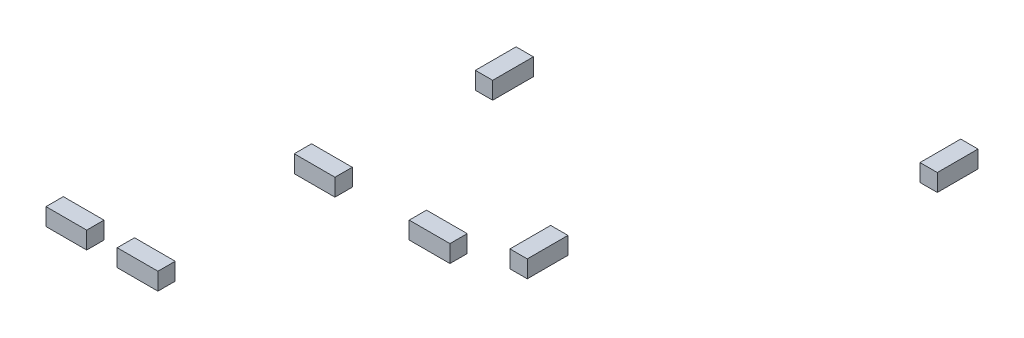
ISO-10303-21;
HEADER;
FILE_DESCRIPTION(('STEP AP214'),'2;1');
FILE_NAME('part.step','',(''),(''),'','','');
FILE_SCHEMA(('AUTOMOTIVE_DESIGN { 1 0 10303 214 1 1 1 1 }'));
ENDSEC;
DATA;
#1=APPLICATION_CONTEXT('core data for automotive mechanical design processes');
#2=APPLICATION_PROTOCOL_DEFINITION('international standard','automotive_design',2000,#1);
#3=PRODUCT_CONTEXT('',#1,'mechanical');
#4=PRODUCT('Part','Part','',(#3));
#5=PRODUCT_RELATED_PRODUCT_CATEGORY('part','',(#4));
#6=PRODUCT_DEFINITION_FORMATION('','',#4);
#7=PRODUCT_DEFINITION_CONTEXT('part definition',#1,'design');
#8=PRODUCT_DEFINITION('design','',#6,#7);
#9=PRODUCT_DEFINITION_SHAPE('','',#8);
#10=(LENGTH_UNIT() NAMED_UNIT(*) SI_UNIT(.MILLI.,.METRE.));
#11=(NAMED_UNIT(*) PLANE_ANGLE_UNIT() SI_UNIT($,.RADIAN.));
#12=(NAMED_UNIT(*) SI_UNIT($,.STERADIAN.) SOLID_ANGLE_UNIT());
#13=UNCERTAINTY_MEASURE_WITH_UNIT(LENGTH_MEASURE(1.E-05),#10,'distance_accuracy_value','');
#14=(GEOMETRIC_REPRESENTATION_CONTEXT(3) GLOBAL_UNCERTAINTY_ASSIGNED_CONTEXT((#13)) GLOBAL_UNIT_ASSIGNED_CONTEXT((#10,
#11,#12)) REPRESENTATION_CONTEXT('',''));
#15=CARTESIAN_POINT('',(0.,0.,0.));
#16=DIRECTION('',(0.,0.,1.));
#17=DIRECTION('',(1.,0.,0.));
#18=AXIS2_PLACEMENT_3D('',#15,#16,#17);
#19=CARTESIAN_POINT('',(3.78459999999999,0.4318,-10.795));
#20=DIRECTION('',(1.,0.,0.));
#21=DIRECTION('',(0.,0.,-1.));
#22=AXIS2_PLACEMENT_3D('',#19,#20,#21);
#23=PLANE('',#22);
#24=DIRECTION('',(0.,0.,1.));
#25=VECTOR('',#24,1.);
#26=CARTESIAN_POINT('',(3.78459999999999,0.,-10.795));
#27=LINE('',#26,#25);
#28=CARTESIAN_POINT('',(3.78459999999999,0.,-11.811));
#29=VERTEX_POINT('',#28);
#30=CARTESIAN_POINT('',(3.78459999999999,0.,-10.795));
#31=VERTEX_POINT('',#30);
#32=EDGE_CURVE('E108',#29,#31,#27,.T.);
#33=ORIENTED_EDGE('',*,*,#32,.T.);
#34=DIRECTION('',(0.,-1.,0.));
#35=VECTOR('',#34,1.);
#36=CARTESIAN_POINT('',(3.78459999999999,0.4318,-10.795));
#37=LINE('',#36,#35);
#38=CARTESIAN_POINT('',(3.78459999999999,0.4318,-10.795));
#39=VERTEX_POINT('',#38);
#40=EDGE_CURVE('E12',#39,#31,#37,.T.);
#41=ORIENTED_EDGE('',*,*,#40,.F.);
#42=DIRECTION('',(0.,0.,1.));
#43=VECTOR('',#42,1.);
#44=CARTESIAN_POINT('',(3.78459999999999,0.4318,-10.795));
#45=LINE('',#44,#43);
#46=CARTESIAN_POINT('',(3.78459999999999,0.4318,-11.811));
#47=VERTEX_POINT('',#46);
#48=EDGE_CURVE('E96',#47,#39,#45,.T.);
#49=ORIENTED_EDGE('',*,*,#48,.F.);
#50=DIRECTION('',(0.,-1.,0.));
#51=VECTOR('',#50,1.);
#52=CARTESIAN_POINT('',(3.78459999999999,0.4318,-11.811));
#53=LINE('',#52,#51);
#54=EDGE_CURVE('E104',#47,#29,#53,.T.);
#55=ORIENTED_EDGE('',*,*,#54,.T.);
#56=EDGE_LOOP('',(#33,#41,#49,#55));
#57=FACE_BOUND('',#56,.T.);
#58=ADVANCED_FACE('F45',(#57),#23,.F.);
#59=CARTESIAN_POINT('',(3.78459999999999,0.4318,-10.795));
#60=DIRECTION('',(0.,0.,-1.));
#61=DIRECTION('',(-1.,0.,0.));
#62=AXIS2_PLACEMENT_3D('',#59,#60,#61);
#63=PLANE('',#62);
#64=DIRECTION('',(1.,0.,0.));
#65=VECTOR('',#64,1.);
#66=CARTESIAN_POINT('',(3.78459999999999,0.,-10.795));
#67=LINE('',#66,#65);
#68=CARTESIAN_POINT('',(4.21639999999999,0.,-10.795));
#69=VERTEX_POINT('',#68);
#70=EDGE_CURVE('E100',#31,#69,#67,.T.);
#71=ORIENTED_EDGE('',*,*,#70,.T.);
#72=DIRECTION('',(0.,-1.,0.));
#73=VECTOR('',#72,1.);
#74=CARTESIAN_POINT('',(4.21639999999999,0.4318,-10.795));
#75=LINE('',#74,#73);
#76=CARTESIAN_POINT('',(4.21639999999999,0.4318,-10.795));
#77=VERTEX_POINT('',#76);
#78=EDGE_CURVE('E53',#77,#69,#75,.T.);
#79=ORIENTED_EDGE('',*,*,#78,.F.);
#80=DIRECTION('',(1.,0.,0.));
#81=VECTOR('',#80,1.);
#82=CARTESIAN_POINT('',(3.78459999999999,0.4318,-10.795));
#83=LINE('',#82,#81);
#84=EDGE_CURVE('E91',#39,#77,#83,.T.);
#85=ORIENTED_EDGE('',*,*,#84,.F.);
#86=ORIENTED_EDGE('',*,*,#40,.T.);
#87=EDGE_LOOP('',(#71,#79,#85,#86));
#88=FACE_BOUND('',#87,.T.);
#89=ADVANCED_FACE('F99',(#88),#63,.F.);
#90=CARTESIAN_POINT('',(4.21639999999999,0.4318,-10.795));
#91=DIRECTION('',(-1.,0.,0.));
#92=DIRECTION('',(0.,0.,1.));
#93=AXIS2_PLACEMENT_3D('',#90,#91,#92);
#94=PLANE('',#93);
#95=DIRECTION('',(0.,0.,-1.));
#96=VECTOR('',#95,1.);
#97=CARTESIAN_POINT('',(4.21639999999999,0.,-10.795));
#98=LINE('',#97,#96);
#99=CARTESIAN_POINT('',(4.21639999999999,0.,-11.811));
#100=VERTEX_POINT('',#99);
#101=EDGE_CURVE('E78',#69,#100,#98,.T.);
#102=ORIENTED_EDGE('',*,*,#101,.T.);
#103=DIRECTION('',(0.,-1.,0.));
#104=VECTOR('',#103,1.);
#105=CARTESIAN_POINT('',(4.21639999999999,0.4318,-11.811));
#106=LINE('',#105,#104);
#107=CARTESIAN_POINT('',(4.21639999999999,0.4318,-11.811));
#108=VERTEX_POINT('',#107);
#109=EDGE_CURVE('E101',#108,#100,#106,.T.);
#110=ORIENTED_EDGE('',*,*,#109,.F.);
#111=DIRECTION('',(0.,0.,-1.));
#112=VECTOR('',#111,1.);
#113=CARTESIAN_POINT('',(4.21639999999999,0.4318,-10.795));
#114=LINE('',#113,#112);
#115=EDGE_CURVE('E94',#77,#108,#114,.T.);
#116=ORIENTED_EDGE('',*,*,#115,.F.);
#117=ORIENTED_EDGE('',*,*,#78,.T.);
#118=EDGE_LOOP('',(#102,#110,#116,#117));
#119=FACE_BOUND('',#118,.T.);
#120=ADVANCED_FACE('F102',(#119),#94,.F.);
#121=CARTESIAN_POINT('',(3.78459999999999,0.4318,-11.811));
#122=DIRECTION('',(0.,0.,1.));
#123=DIRECTION('',(1.,0.,0.));
#124=AXIS2_PLACEMENT_3D('',#121,#122,#123);
#125=PLANE('',#124);
#126=DIRECTION('',(-1.,0.,0.));
#127=VECTOR('',#126,1.);
#128=CARTESIAN_POINT('',(3.78459999999999,0.,-11.811));
#129=LINE('',#128,#127);
#130=EDGE_CURVE('E84',#100,#29,#129,.T.);
#131=ORIENTED_EDGE('',*,*,#130,.T.);
#132=ORIENTED_EDGE('',*,*,#54,.F.);
#133=DIRECTION('',(-1.,0.,0.));
#134=VECTOR('',#133,1.);
#135=CARTESIAN_POINT('',(3.78459999999999,0.4318,-11.811));
#136=LINE('',#135,#134);
#137=EDGE_CURVE('E61',#108,#47,#136,.T.);
#138=ORIENTED_EDGE('',*,*,#137,.F.);
#139=ORIENTED_EDGE('',*,*,#109,.T.);
#140=EDGE_LOOP('',(#131,#132,#138,#139));
#141=FACE_BOUND('',#140,.T.);
#142=ADVANCED_FACE('F115',(#141),#125,.F.);
#143=CARTESIAN_POINT('',(0.,0.4318,0.));
#144=DIRECTION('',(0.,-1.,0.));
#145=DIRECTION('',(0.,0.,-1.));
#146=AXIS2_PLACEMENT_3D('',#143,#144,#145);
#147=PLANE('',#146);
#148=ORIENTED_EDGE('',*,*,#48,.T.);
#149=ORIENTED_EDGE('',*,*,#84,.T.);
#150=ORIENTED_EDGE('',*,*,#115,.T.);
#151=ORIENTED_EDGE('',*,*,#137,.T.);
#152=EDGE_LOOP('',(#148,#149,#150,#151));
#153=FACE_BOUND('',#152,.T.);
#154=ADVANCED_FACE('F92',(#153),#147,.F.);
#155=CARTESIAN_POINT('',(0.,0.,0.));
#156=DIRECTION('',(0.,-1.,0.));
#157=DIRECTION('',(0.,0.,-1.));
#158=AXIS2_PLACEMENT_3D('',#155,#156,#157);
#159=PLANE('',#158);
#160=ORIENTED_EDGE('',*,*,#32,.F.);
#161=ORIENTED_EDGE('',*,*,#130,.F.);
#162=ORIENTED_EDGE('',*,*,#101,.F.);
#163=ORIENTED_EDGE('',*,*,#70,.F.);
#164=EDGE_LOOP('',(#160,#161,#162,#163));
#165=FACE_BOUND('',#164,.T.);
#166=ADVANCED_FACE('F118',(#165),#159,.T.);
#167=CLOSED_SHELL('',(#58,#89,#120,#142,#154,#166));
#168=MANIFOLD_SOLID_BREP('B2',#167);
#169=CARTESIAN_POINT('',(1.905,0.4318,-10.5918));
#170=DIRECTION('',(1.,0.,0.));
#171=DIRECTION('',(0.,0.,-1.));
#172=AXIS2_PLACEMENT_3D('',#169,#170,#171);
#173=PLANE('',#172);
#174=DIRECTION('',(0.,0.,1.));
#175=VECTOR('',#174,1.);
#176=CARTESIAN_POINT('',(1.905,0.,-10.5918));
#177=LINE('',#176,#175);
#178=CARTESIAN_POINT('',(1.905,0.,-10.5918));
#179=VERTEX_POINT('',#178);
#180=CARTESIAN_POINT('',(1.905,0.,-10.16));
#181=VERTEX_POINT('',#180);
#182=EDGE_CURVE('E241',#179,#181,#177,.T.);
#183=ORIENTED_EDGE('',*,*,#182,.T.);
#184=DIRECTION('',(0.,-1.,0.));
#185=VECTOR('',#184,1.);
#186=CARTESIAN_POINT('',(1.905,0.4318,-10.16));
#187=LINE('',#186,#185);
#188=CARTESIAN_POINT('',(1.905,0.4318,-10.16));
#189=VERTEX_POINT('',#188);
#190=EDGE_CURVE('E43',#189,#181,#187,.T.);
#191=ORIENTED_EDGE('',*,*,#190,.F.);
#192=DIRECTION('',(0.,0.,1.));
#193=VECTOR('',#192,1.);
#194=CARTESIAN_POINT('',(1.905,0.4318,-10.5918));
#195=LINE('',#194,#193);
#196=CARTESIAN_POINT('',(1.905,0.4318,-10.5918));
#197=VERTEX_POINT('',#196);
#198=EDGE_CURVE('E229',#197,#189,#195,.T.);
#199=ORIENTED_EDGE('',*,*,#198,.F.);
#200=DIRECTION('',(0.,-1.,0.));
#201=VECTOR('',#200,1.);
#202=CARTESIAN_POINT('',(1.905,0.4318,-10.5918));
#203=LINE('',#202,#201);
#204=EDGE_CURVE('E237',#197,#179,#203,.T.);
#205=ORIENTED_EDGE('',*,*,#204,.T.);
#206=EDGE_LOOP('',(#183,#191,#199,#205));
#207=FACE_BOUND('',#206,.T.);
#208=ADVANCED_FACE('F178',(#207),#173,.F.);
#209=CARTESIAN_POINT('',(1.905,0.4318,-10.16));
#210=DIRECTION('',(0.,0.,-1.));
#211=DIRECTION('',(-1.,0.,0.));
#212=AXIS2_PLACEMENT_3D('',#209,#210,#211);
#213=PLANE('',#212);
#214=DIRECTION('',(1.,0.,0.));
#215=VECTOR('',#214,1.);
#216=CARTESIAN_POINT('',(1.905,0.,-10.16));
#217=LINE('',#216,#215);
#218=CARTESIAN_POINT('',(2.921,0.,-10.16));
#219=VERTEX_POINT('',#218);
#220=EDGE_CURVE('E233',#181,#219,#217,.T.);
#221=ORIENTED_EDGE('',*,*,#220,.T.);
#222=DIRECTION('',(0.,-1.,0.));
#223=VECTOR('',#222,1.);
#224=CARTESIAN_POINT('',(2.921,0.4318,-10.16));
#225=LINE('',#224,#223);
#226=CARTESIAN_POINT('',(2.921,0.4318,-10.16));
#227=VERTEX_POINT('',#226);
#228=EDGE_CURVE('E186',#227,#219,#225,.T.);
#229=ORIENTED_EDGE('',*,*,#228,.F.);
#230=DIRECTION('',(1.,0.,0.));
#231=VECTOR('',#230,1.);
#232=CARTESIAN_POINT('',(1.905,0.4318,-10.16));
#233=LINE('',#232,#231);
#234=EDGE_CURVE('E224',#189,#227,#233,.T.);
#235=ORIENTED_EDGE('',*,*,#234,.F.);
#236=ORIENTED_EDGE('',*,*,#190,.T.);
#237=EDGE_LOOP('',(#221,#229,#235,#236));
#238=FACE_BOUND('',#237,.T.);
#239=ADVANCED_FACE('F232',(#238),#213,.F.);
#240=CARTESIAN_POINT('',(2.921,0.4318,-10.5918));
#241=DIRECTION('',(-1.,0.,0.));
#242=DIRECTION('',(0.,0.,1.));
#243=AXIS2_PLACEMENT_3D('',#240,#241,#242);
#244=PLANE('',#243);
#245=DIRECTION('',(0.,0.,-1.));
#246=VECTOR('',#245,1.);
#247=CARTESIAN_POINT('',(2.921,0.,-10.5918));
#248=LINE('',#247,#246);
#249=CARTESIAN_POINT('',(2.921,0.,-10.5918));
#250=VERTEX_POINT('',#249);
#251=EDGE_CURVE('E211',#219,#250,#248,.T.);
#252=ORIENTED_EDGE('',*,*,#251,.T.);
#253=DIRECTION('',(0.,-1.,0.));
#254=VECTOR('',#253,1.);
#255=CARTESIAN_POINT('',(2.921,0.4318,-10.5918));
#256=LINE('',#255,#254);
#257=CARTESIAN_POINT('',(2.921,0.4318,-10.5918));
#258=VERTEX_POINT('',#257);
#259=EDGE_CURVE('E234',#258,#250,#256,.T.);
#260=ORIENTED_EDGE('',*,*,#259,.F.);
#261=DIRECTION('',(0.,0.,-1.));
#262=VECTOR('',#261,1.);
#263=CARTESIAN_POINT('',(2.921,0.4318,-10.5918));
#264=LINE('',#263,#262);
#265=EDGE_CURVE('E227',#227,#258,#264,.T.);
#266=ORIENTED_EDGE('',*,*,#265,.F.);
#267=ORIENTED_EDGE('',*,*,#228,.T.);
#268=EDGE_LOOP('',(#252,#260,#266,#267));
#269=FACE_BOUND('',#268,.T.);
#270=ADVANCED_FACE('F235',(#269),#244,.F.);
#271=CARTESIAN_POINT('',(1.905,0.4318,-10.5918));
#272=DIRECTION('',(0.,0.,1.));
#273=DIRECTION('',(1.,0.,0.));
#274=AXIS2_PLACEMENT_3D('',#271,#272,#273);
#275=PLANE('',#274);
#276=DIRECTION('',(-1.,0.,0.));
#277=VECTOR('',#276,1.);
#278=CARTESIAN_POINT('',(1.905,0.,-10.5918));
#279=LINE('',#278,#277);
#280=EDGE_CURVE('E217',#250,#179,#279,.T.);
#281=ORIENTED_EDGE('',*,*,#280,.T.);
#282=ORIENTED_EDGE('',*,*,#204,.F.);
#283=DIRECTION('',(-1.,0.,0.));
#284=VECTOR('',#283,1.);
#285=CARTESIAN_POINT('',(1.905,0.4318,-10.5918));
#286=LINE('',#285,#284);
#287=EDGE_CURVE('E194',#258,#197,#286,.T.);
#288=ORIENTED_EDGE('',*,*,#287,.F.);
#289=ORIENTED_EDGE('',*,*,#259,.T.);
#290=EDGE_LOOP('',(#281,#282,#288,#289));
#291=FACE_BOUND('',#290,.T.);
#292=ADVANCED_FACE('F248',(#291),#275,.F.);
#293=CARTESIAN_POINT('',(0.,0.4318,0.));
#294=DIRECTION('',(0.,1.,0.));
#295=DIRECTION('',(0.,0.,1.));
#296=AXIS2_PLACEMENT_3D('',#293,#294,#295);
#297=PLANE('',#296);
#298=ORIENTED_EDGE('',*,*,#198,.T.);
#299=ORIENTED_EDGE('',*,*,#234,.T.);
#300=ORIENTED_EDGE('',*,*,#265,.T.);
#301=ORIENTED_EDGE('',*,*,#287,.T.);
#302=EDGE_LOOP('',(#298,#299,#300,#301));
#303=FACE_BOUND('',#302,.T.);
#304=ADVANCED_FACE('F225',(#303),#297,.T.);
#305=CARTESIAN_POINT('',(0.,0.,0.));
#306=DIRECTION('',(0.,1.,0.));
#307=DIRECTION('',(0.,0.,1.));
#308=AXIS2_PLACEMENT_3D('',#305,#306,#307);
#309=PLANE('',#308);
#310=ORIENTED_EDGE('',*,*,#182,.F.);
#311=ORIENTED_EDGE('',*,*,#280,.F.);
#312=ORIENTED_EDGE('',*,*,#251,.F.);
#313=ORIENTED_EDGE('',*,*,#220,.F.);
#314=EDGE_LOOP('',(#310,#311,#312,#313));
#315=FACE_BOUND('',#314,.T.);
#316=ADVANCED_FACE('F251',(#315),#309,.F.);
#317=CLOSED_SHELL('',(#208,#239,#270,#292,#304,#316));
#318=MANIFOLD_SOLID_BREP('B6',#317);
#319=CARTESIAN_POINT('',(-0.9652,0.4318,-10.5918));
#320=DIRECTION('',(1.,0.,0.));
#321=DIRECTION('',(0.,0.,-1.));
#322=AXIS2_PLACEMENT_3D('',#319,#320,#321);
#323=PLANE('',#322);
#324=DIRECTION('',(0.,0.,1.));
#325=VECTOR('',#324,1.);
#326=CARTESIAN_POINT('',(-0.9652,0.,-10.5918));
#327=LINE('',#326,#325);
#328=CARTESIAN_POINT('',(-0.9652,0.,-10.5918));
#329=VERTEX_POINT('',#328);
#330=CARTESIAN_POINT('',(-0.9652,0.,-10.16));
#331=VERTEX_POINT('',#330);
#332=EDGE_CURVE('E374',#329,#331,#327,.T.);
#333=ORIENTED_EDGE('',*,*,#332,.T.);
#334=DIRECTION('',(0.,-1.,0.));
#335=VECTOR('',#334,1.);
#336=CARTESIAN_POINT('',(-0.9652,0.4318,-10.16));
#337=LINE('',#336,#335);
#338=CARTESIAN_POINT('',(-0.9652,0.4318,-10.16));
#339=VERTEX_POINT('',#338);
#340=EDGE_CURVE('E176',#339,#331,#337,.T.);
#341=ORIENTED_EDGE('',*,*,#340,.F.);
#342=DIRECTION('',(0.,0.,1.));
#343=VECTOR('',#342,1.);
#344=CARTESIAN_POINT('',(-0.9652,0.4318,-10.5918));
#345=LINE('',#344,#343);
#346=CARTESIAN_POINT('',(-0.9652,0.4318,-10.5918));
#347=VERTEX_POINT('',#346);
#348=EDGE_CURVE('E362',#347,#339,#345,.T.);
#349=ORIENTED_EDGE('',*,*,#348,.F.);
#350=DIRECTION('',(0.,-1.,0.));
#351=VECTOR('',#350,1.);
#352=CARTESIAN_POINT('',(-0.9652,0.4318,-10.5918));
#353=LINE('',#352,#351);
#354=EDGE_CURVE('E370',#347,#329,#353,.T.);
#355=ORIENTED_EDGE('',*,*,#354,.T.);
#356=EDGE_LOOP('',(#333,#341,#349,#355));
#357=FACE_BOUND('',#356,.T.);
#358=ADVANCED_FACE('F311',(#357),#323,.F.);
#359=CARTESIAN_POINT('',(-0.9652,0.4318,-10.16));
#360=DIRECTION('',(0.,0.,-1.));
#361=DIRECTION('',(-1.,0.,0.));
#362=AXIS2_PLACEMENT_3D('',#359,#360,#361);
#363=PLANE('',#362);
#364=DIRECTION('',(1.,0.,0.));
#365=VECTOR('',#364,1.);
#366=CARTESIAN_POINT('',(-0.9652,0.,-10.16));
#367=LINE('',#366,#365);
#368=CARTESIAN_POINT('',(0.0508000000000002,0.,-10.16));
#369=VERTEX_POINT('',#368);
#370=EDGE_CURVE('E366',#331,#369,#367,.T.);
#371=ORIENTED_EDGE('',*,*,#370,.T.);
#372=DIRECTION('',(0.,-1.,0.));
#373=VECTOR('',#372,1.);
#374=CARTESIAN_POINT('',(0.0508000000000002,0.4318,-10.16));
#375=LINE('',#374,#373);
#376=CARTESIAN_POINT('',(0.0508000000000002,0.4318,-10.16));
#377=VERTEX_POINT('',#376);
#378=EDGE_CURVE('E319',#377,#369,#375,.T.);
#379=ORIENTED_EDGE('',*,*,#378,.F.);
#380=DIRECTION('',(1.,0.,0.));
#381=VECTOR('',#380,1.);
#382=CARTESIAN_POINT('',(-0.9652,0.4318,-10.16));
#383=LINE('',#382,#381);
#384=EDGE_CURVE('E357',#339,#377,#383,.T.);
#385=ORIENTED_EDGE('',*,*,#384,.F.);
#386=ORIENTED_EDGE('',*,*,#340,.T.);
#387=EDGE_LOOP('',(#371,#379,#385,#386));
#388=FACE_BOUND('',#387,.T.);
#389=ADVANCED_FACE('F365',(#388),#363,.F.);
#390=CARTESIAN_POINT('',(0.0508000000000002,0.4318,-10.5918));
#391=DIRECTION('',(-1.,0.,0.));
#392=DIRECTION('',(0.,0.,1.));
#393=AXIS2_PLACEMENT_3D('',#390,#391,#392);
#394=PLANE('',#393);
#395=DIRECTION('',(0.,0.,-1.));
#396=VECTOR('',#395,1.);
#397=CARTESIAN_POINT('',(0.0508000000000002,0.,-10.5918));
#398=LINE('',#397,#396);
#399=CARTESIAN_POINT('',(0.0508000000000002,0.,-10.5918));
#400=VERTEX_POINT('',#399);
#401=EDGE_CURVE('E344',#369,#400,#398,.T.);
#402=ORIENTED_EDGE('',*,*,#401,.T.);
#403=DIRECTION('',(0.,-1.,0.));
#404=VECTOR('',#403,1.);
#405=CARTESIAN_POINT('',(0.0508000000000002,0.4318,-10.5918));
#406=LINE('',#405,#404);
#407=CARTESIAN_POINT('',(0.0508000000000002,0.4318,-10.5918));
#408=VERTEX_POINT('',#407);
#409=EDGE_CURVE('E367',#408,#400,#406,.T.);
#410=ORIENTED_EDGE('',*,*,#409,.F.);
#411=DIRECTION('',(0.,0.,-1.));
#412=VECTOR('',#411,1.);
#413=CARTESIAN_POINT('',(0.0508000000000002,0.4318,-10.5918));
#414=LINE('',#413,#412);
#415=EDGE_CURVE('E360',#377,#408,#414,.T.);
#416=ORIENTED_EDGE('',*,*,#415,.F.);
#417=ORIENTED_EDGE('',*,*,#378,.T.);
#418=EDGE_LOOP('',(#402,#410,#416,#417));
#419=FACE_BOUND('',#418,.T.);
#420=ADVANCED_FACE('F368',(#419),#394,.F.);
#421=CARTESIAN_POINT('',(-0.9652,0.4318,-10.5918));
#422=DIRECTION('',(0.,0.,1.));
#423=DIRECTION('',(1.,0.,0.));
#424=AXIS2_PLACEMENT_3D('',#421,#422,#423);
#425=PLANE('',#424);
#426=DIRECTION('',(-1.,0.,0.));
#427=VECTOR('',#426,1.);
#428=CARTESIAN_POINT('',(-0.9652,0.,-10.5918));
#429=LINE('',#428,#427);
#430=EDGE_CURVE('E350',#400,#329,#429,.T.);
#431=ORIENTED_EDGE('',*,*,#430,.T.);
#432=ORIENTED_EDGE('',*,*,#354,.F.);
#433=DIRECTION('',(-1.,0.,0.));
#434=VECTOR('',#433,1.);
#435=CARTESIAN_POINT('',(-0.9652,0.4318,-10.5918));
#436=LINE('',#435,#434);
#437=EDGE_CURVE('E327',#408,#347,#436,.T.);
#438=ORIENTED_EDGE('',*,*,#437,.F.);
#439=ORIENTED_EDGE('',*,*,#409,.T.);
#440=EDGE_LOOP('',(#431,#432,#438,#439));
#441=FACE_BOUND('',#440,.T.);
#442=ADVANCED_FACE('F381',(#441),#425,.F.);
#443=CARTESIAN_POINT('',(0.,0.4318,0.));
#444=DIRECTION('',(0.,1.,0.));
#445=DIRECTION('',(0.,0.,1.));
#446=AXIS2_PLACEMENT_3D('',#443,#444,#445);
#447=PLANE('',#446);
#448=ORIENTED_EDGE('',*,*,#348,.T.);
#449=ORIENTED_EDGE('',*,*,#384,.T.);
#450=ORIENTED_EDGE('',*,*,#415,.T.);
#451=ORIENTED_EDGE('',*,*,#437,.T.);
#452=EDGE_LOOP('',(#448,#449,#450,#451));
#453=FACE_BOUND('',#452,.T.);
#454=ADVANCED_FACE('F358',(#453),#447,.T.);
#455=CARTESIAN_POINT('',(0.,0.,0.));
#456=DIRECTION('',(0.,1.,0.));
#457=DIRECTION('',(0.,0.,1.));
#458=AXIS2_PLACEMENT_3D('',#455,#456,#457);
#459=PLANE('',#458);
#460=ORIENTED_EDGE('',*,*,#332,.F.);
#461=ORIENTED_EDGE('',*,*,#430,.F.);
#462=ORIENTED_EDGE('',*,*,#401,.F.);
#463=ORIENTED_EDGE('',*,*,#370,.F.);
#464=EDGE_LOOP('',(#460,#461,#462,#463));
#465=FACE_BOUND('',#464,.T.);
#466=ADVANCED_FACE('F384',(#465),#459,.F.);
#467=CLOSED_SHELL('',(#358,#389,#420,#442,#454,#466));
#468=MANIFOLD_SOLID_BREP('B37',#467);
#469=CARTESIAN_POINT('',(-2.921,0.4318,-6.35));
#470=DIRECTION('',(1.,0.,0.));
#471=DIRECTION('',(0.,0.,-1.));
#472=AXIS2_PLACEMENT_3D('',#469,#470,#471);
#473=PLANE('',#472);
#474=DIRECTION('',(0.,0.,1.));
#475=VECTOR('',#474,1.);
#476=CARTESIAN_POINT('',(-2.921,0.,-6.35));
#477=LINE('',#476,#475);
#478=CARTESIAN_POINT('',(-2.921,0.,-6.35));
#479=VERTEX_POINT('',#478);
#480=CARTESIAN_POINT('',(-2.921,0.,-5.9182));
#481=VERTEX_POINT('',#480);
#482=EDGE_CURVE('E507',#479,#481,#477,.T.);
#483=ORIENTED_EDGE('',*,*,#482,.T.);
#484=DIRECTION('',(0.,-1.,0.));
#485=VECTOR('',#484,1.);
#486=CARTESIAN_POINT('',(-2.921,0.4318,-5.9182));
#487=LINE('',#486,#485);
#488=CARTESIAN_POINT('',(-2.921,0.4318,-5.9182));
#489=VERTEX_POINT('',#488);
#490=EDGE_CURVE('E309',#489,#481,#487,.T.);
#491=ORIENTED_EDGE('',*,*,#490,.F.);
#492=DIRECTION('',(0.,0.,1.));
#493=VECTOR('',#492,1.);
#494=CARTESIAN_POINT('',(-2.921,0.4318,-6.35));
#495=LINE('',#494,#493);
#496=CARTESIAN_POINT('',(-2.921,0.4318,-6.35));
#497=VERTEX_POINT('',#496);
#498=EDGE_CURVE('E495',#497,#489,#495,.T.);
#499=ORIENTED_EDGE('',*,*,#498,.F.);
#500=DIRECTION('',(0.,-1.,0.));
#501=VECTOR('',#500,1.);
#502=CARTESIAN_POINT('',(-2.921,0.4318,-6.35));
#503=LINE('',#502,#501);
#504=EDGE_CURVE('E503',#497,#479,#503,.T.);
#505=ORIENTED_EDGE('',*,*,#504,.T.);
#506=EDGE_LOOP('',(#483,#491,#499,#505));
#507=FACE_BOUND('',#506,.T.);
#508=ADVANCED_FACE('F444',(#507),#473,.F.);
#509=CARTESIAN_POINT('',(-2.921,0.4318,-5.9182));
#510=DIRECTION('',(0.,0.,-1.));
#511=DIRECTION('',(-1.,0.,0.));
#512=AXIS2_PLACEMENT_3D('',#509,#510,#511);
#513=PLANE('',#512);
#514=DIRECTION('',(1.,0.,0.));
#515=VECTOR('',#514,1.);
#516=CARTESIAN_POINT('',(-2.921,0.,-5.9182));
#517=LINE('',#516,#515);
#518=CARTESIAN_POINT('',(-1.905,0.,-5.9182));
#519=VERTEX_POINT('',#518);
#520=EDGE_CURVE('E499',#481,#519,#517,.T.);
#521=ORIENTED_EDGE('',*,*,#520,.T.);
#522=DIRECTION('',(0.,-1.,0.));
#523=VECTOR('',#522,1.);
#524=CARTESIAN_POINT('',(-1.905,0.4318,-5.9182));
#525=LINE('',#524,#523);
#526=CARTESIAN_POINT('',(-1.905,0.4318,-5.9182));
#527=VERTEX_POINT('',#526);
#528=EDGE_CURVE('E452',#527,#519,#525,.T.);
#529=ORIENTED_EDGE('',*,*,#528,.F.);
#530=DIRECTION('',(1.,0.,0.));
#531=VECTOR('',#530,1.);
#532=CARTESIAN_POINT('',(-2.921,0.4318,-5.9182));
#533=LINE('',#532,#531);
#534=EDGE_CURVE('E490',#489,#527,#533,.T.);
#535=ORIENTED_EDGE('',*,*,#534,.F.);
#536=ORIENTED_EDGE('',*,*,#490,.T.);
#537=EDGE_LOOP('',(#521,#529,#535,#536));
#538=FACE_BOUND('',#537,.T.);
#539=ADVANCED_FACE('F498',(#538),#513,.F.);
#540=CARTESIAN_POINT('',(-1.905,0.4318,-6.35));
#541=DIRECTION('',(-1.,0.,0.));
#542=DIRECTION('',(0.,0.,1.));
#543=AXIS2_PLACEMENT_3D('',#540,#541,#542);
#544=PLANE('',#543);
#545=DIRECTION('',(0.,0.,-1.));
#546=VECTOR('',#545,1.);
#547=CARTESIAN_POINT('',(-1.905,0.,-6.35));
#548=LINE('',#547,#546);
#549=CARTESIAN_POINT('',(-1.905,0.,-6.35));
#550=VERTEX_POINT('',#549);
#551=EDGE_CURVE('E477',#519,#550,#548,.T.);
#552=ORIENTED_EDGE('',*,*,#551,.T.);
#553=DIRECTION('',(0.,-1.,0.));
#554=VECTOR('',#553,1.);
#555=CARTESIAN_POINT('',(-1.905,0.4318,-6.35));
#556=LINE('',#555,#554);
#557=CARTESIAN_POINT('',(-1.905,0.4318,-6.35));
#558=VERTEX_POINT('',#557);
#559=EDGE_CURVE('E500',#558,#550,#556,.T.);
#560=ORIENTED_EDGE('',*,*,#559,.F.);
#561=DIRECTION('',(0.,0.,-1.));
#562=VECTOR('',#561,1.);
#563=CARTESIAN_POINT('',(-1.905,0.4318,-6.35));
#564=LINE('',#563,#562);
#565=EDGE_CURVE('E493',#527,#558,#564,.T.);
#566=ORIENTED_EDGE('',*,*,#565,.F.);
#567=ORIENTED_EDGE('',*,*,#528,.T.);
#568=EDGE_LOOP('',(#552,#560,#566,#567));
#569=FACE_BOUND('',#568,.T.);
#570=ADVANCED_FACE('F501',(#569),#544,.F.);
#571=CARTESIAN_POINT('',(-2.921,0.4318,-6.35));
#572=DIRECTION('',(0.,0.,1.));
#573=DIRECTION('',(1.,0.,0.));
#574=AXIS2_PLACEMENT_3D('',#571,#572,#573);
#575=PLANE('',#574);
#576=DIRECTION('',(-1.,0.,0.));
#577=VECTOR('',#576,1.);
#578=CARTESIAN_POINT('',(-2.921,0.,-6.35));
#579=LINE('',#578,#577);
#580=EDGE_CURVE('E483',#550,#479,#579,.T.);
#581=ORIENTED_EDGE('',*,*,#580,.T.);
#582=ORIENTED_EDGE('',*,*,#504,.F.);
#583=DIRECTION('',(-1.,0.,0.));
#584=VECTOR('',#583,1.);
#585=CARTESIAN_POINT('',(-2.921,0.4318,-6.35));
#586=LINE('',#585,#584);
#587=EDGE_CURVE('E460',#558,#497,#586,.T.);
#588=ORIENTED_EDGE('',*,*,#587,.F.);
#589=ORIENTED_EDGE('',*,*,#559,.T.);
#590=EDGE_LOOP('',(#581,#582,#588,#589));
#591=FACE_BOUND('',#590,.T.);
#592=ADVANCED_FACE('F514',(#591),#575,.F.);
#593=CARTESIAN_POINT('',(0.,0.4318,0.));
#594=DIRECTION('',(0.,1.,0.));
#595=DIRECTION('',(0.,0.,1.));
#596=AXIS2_PLACEMENT_3D('',#593,#594,#595);
#597=PLANE('',#596);
#598=ORIENTED_EDGE('',*,*,#498,.T.);
#599=ORIENTED_EDGE('',*,*,#534,.T.);
#600=ORIENTED_EDGE('',*,*,#565,.T.);
#601=ORIENTED_EDGE('',*,*,#587,.T.);
#602=EDGE_LOOP('',(#598,#599,#600,#601));
#603=FACE_BOUND('',#602,.T.);
#604=ADVANCED_FACE('F491',(#603),#597,.T.);
#605=CARTESIAN_POINT('',(0.,0.,0.));
#606=DIRECTION('',(0.,1.,0.));
#607=DIRECTION('',(0.,0.,1.));
#608=AXIS2_PLACEMENT_3D('',#605,#606,#607);
#609=PLANE('',#608);
#610=ORIENTED_EDGE('',*,*,#482,.F.);
#611=ORIENTED_EDGE('',*,*,#580,.F.);
#612=ORIENTED_EDGE('',*,*,#551,.F.);
#613=ORIENTED_EDGE('',*,*,#520,.F.);
#614=EDGE_LOOP('',(#610,#611,#612,#613));
#615=FACE_BOUND('',#614,.T.);
#616=ADVANCED_FACE('F517',(#615),#609,.F.);
#617=CLOSED_SHELL('',(#508,#539,#570,#592,#604,#616));
#618=MANIFOLD_SOLID_BREP('B170',#617);
#619=CARTESIAN_POINT('',(7.4676,0.4318,-17.78));
#620=DIRECTION('',(-1.,0.,0.));
#621=DIRECTION('',(0.,0.,1.));
#622=AXIS2_PLACEMENT_3D('',#619,#620,#621);
#623=PLANE('',#622);
#624=DIRECTION('',(0.,0.,-1.));
#625=VECTOR('',#624,1.);
#626=CARTESIAN_POINT('',(7.4676,0.,-17.78));
#627=LINE('',#626,#625);
#628=CARTESIAN_POINT('',(7.4676,0.,-17.78));
#629=VERTEX_POINT('',#628);
#630=CARTESIAN_POINT('',(7.4676,0.,-18.796));
#631=VERTEX_POINT('',#630);
#632=EDGE_CURVE('E640',#629,#631,#627,.T.);
#633=ORIENTED_EDGE('',*,*,#632,.T.);
#634=DIRECTION('',(0.,-1.,0.));
#635=VECTOR('',#634,1.);
#636=CARTESIAN_POINT('',(7.4676,0.4318,-18.796));
#637=LINE('',#636,#635);
#638=CARTESIAN_POINT('',(7.4676,0.4318,-18.796));
#639=VERTEX_POINT('',#638);
#640=EDGE_CURVE('E442',#639,#631,#637,.T.);
#641=ORIENTED_EDGE('',*,*,#640,.F.);
#642=DIRECTION('',(0.,0.,-1.));
#643=VECTOR('',#642,1.);
#644=CARTESIAN_POINT('',(7.4676,0.4318,-17.78));
#645=LINE('',#644,#643);
#646=CARTESIAN_POINT('',(7.4676,0.4318,-17.78));
#647=VERTEX_POINT('',#646);
#648=EDGE_CURVE('E628',#647,#639,#645,.T.);
#649=ORIENTED_EDGE('',*,*,#648,.F.);
#650=DIRECTION('',(0.,-1.,0.));
#651=VECTOR('',#650,1.);
#652=CARTESIAN_POINT('',(7.4676,0.4318,-17.78));
#653=LINE('',#652,#651);
#654=EDGE_CURVE('E636',#647,#629,#653,.T.);
#655=ORIENTED_EDGE('',*,*,#654,.T.);
#656=EDGE_LOOP('',(#633,#641,#649,#655));
#657=FACE_BOUND('',#656,.T.);
#658=ADVANCED_FACE('F577',(#657),#623,.F.);
#659=CARTESIAN_POINT('',(7.4676,0.4318,-18.796));
#660=DIRECTION('',(0.,0.,1.));
#661=DIRECTION('',(1.,0.,0.));
#662=AXIS2_PLACEMENT_3D('',#659,#660,#661);
#663=PLANE('',#662);
#664=DIRECTION('',(-1.,0.,0.));
#665=VECTOR('',#664,1.);
#666=CARTESIAN_POINT('',(7.4676,0.,-18.796));
#667=LINE('',#666,#665);
#668=CARTESIAN_POINT('',(7.0358,0.,-18.796));
#669=VERTEX_POINT('',#668);
#670=EDGE_CURVE('E632',#631,#669,#667,.T.);
#671=ORIENTED_EDGE('',*,*,#670,.T.);
#672=DIRECTION('',(0.,-1.,0.));
#673=VECTOR('',#672,1.);
#674=CARTESIAN_POINT('',(7.0358,0.4318,-18.796));
#675=LINE('',#674,#673);
#676=CARTESIAN_POINT('',(7.0358,0.4318,-18.796));
#677=VERTEX_POINT('',#676);
#678=EDGE_CURVE('E585',#677,#669,#675,.T.);
#679=ORIENTED_EDGE('',*,*,#678,.F.);
#680=DIRECTION('',(-1.,0.,0.));
#681=VECTOR('',#680,1.);
#682=CARTESIAN_POINT('',(7.4676,0.4318,-18.796));
#683=LINE('',#682,#681);
#684=EDGE_CURVE('E623',#639,#677,#683,.T.);
#685=ORIENTED_EDGE('',*,*,#684,.F.);
#686=ORIENTED_EDGE('',*,*,#640,.T.);
#687=EDGE_LOOP('',(#671,#679,#685,#686));
#688=FACE_BOUND('',#687,.T.);
#689=ADVANCED_FACE('F631',(#688),#663,.F.);
#690=CARTESIAN_POINT('',(7.0358,0.4318,-17.78));
#691=DIRECTION('',(1.,0.,0.));
#692=DIRECTION('',(0.,0.,-1.));
#693=AXIS2_PLACEMENT_3D('',#690,#691,#692);
#694=PLANE('',#693);
#695=DIRECTION('',(0.,0.,1.));
#696=VECTOR('',#695,1.);
#697=CARTESIAN_POINT('',(7.0358,0.,-17.78));
#698=LINE('',#697,#696);
#699=CARTESIAN_POINT('',(7.0358,0.,-17.78));
#700=VERTEX_POINT('',#699);
#701=EDGE_CURVE('E610',#669,#700,#698,.T.);
#702=ORIENTED_EDGE('',*,*,#701,.T.);
#703=DIRECTION('',(0.,-1.,0.));
#704=VECTOR('',#703,1.);
#705=CARTESIAN_POINT('',(7.0358,0.4318,-17.78));
#706=LINE('',#705,#704);
#707=CARTESIAN_POINT('',(7.0358,0.4318,-17.78));
#708=VERTEX_POINT('',#707);
#709=EDGE_CURVE('E633',#708,#700,#706,.T.);
#710=ORIENTED_EDGE('',*,*,#709,.F.);
#711=DIRECTION('',(0.,0.,1.));
#712=VECTOR('',#711,1.);
#713=CARTESIAN_POINT('',(7.0358,0.4318,-17.78));
#714=LINE('',#713,#712);
#715=EDGE_CURVE('E626',#677,#708,#714,.T.);
#716=ORIENTED_EDGE('',*,*,#715,.F.);
#717=ORIENTED_EDGE('',*,*,#678,.T.);
#718=EDGE_LOOP('',(#702,#710,#716,#717));
#719=FACE_BOUND('',#718,.T.);
#720=ADVANCED_FACE('F634',(#719),#694,.F.);
#721=CARTESIAN_POINT('',(7.4676,0.4318,-17.78));
#722=DIRECTION('',(0.,0.,-1.));
#723=DIRECTION('',(-1.,0.,0.));
#724=AXIS2_PLACEMENT_3D('',#721,#722,#723);
#725=PLANE('',#724);
#726=DIRECTION('',(1.,0.,0.));
#727=VECTOR('',#726,1.);
#728=CARTESIAN_POINT('',(7.4676,0.,-17.78));
#729=LINE('',#728,#727);
#730=EDGE_CURVE('E616',#700,#629,#729,.T.);
#731=ORIENTED_EDGE('',*,*,#730,.T.);
#732=ORIENTED_EDGE('',*,*,#654,.F.);
#733=DIRECTION('',(1.,0.,0.));
#734=VECTOR('',#733,1.);
#735=CARTESIAN_POINT('',(7.4676,0.4318,-17.78));
#736=LINE('',#735,#734);
#737=EDGE_CURVE('E593',#708,#647,#736,.T.);
#738=ORIENTED_EDGE('',*,*,#737,.F.);
#739=ORIENTED_EDGE('',*,*,#709,.T.);
#740=EDGE_LOOP('',(#731,#732,#738,#739));
#741=FACE_BOUND('',#740,.T.);
#742=ADVANCED_FACE('F647',(#741),#725,.F.);
#743=CARTESIAN_POINT('',(0.,0.4318,0.));
#744=DIRECTION('',(0.,1.,0.));
#745=DIRECTION('',(0.,0.,1.));
#746=AXIS2_PLACEMENT_3D('',#743,#744,#745);
#747=PLANE('',#746);
#748=ORIENTED_EDGE('',*,*,#648,.T.);
#749=ORIENTED_EDGE('',*,*,#684,.T.);
#750=ORIENTED_EDGE('',*,*,#715,.T.);
#751=ORIENTED_EDGE('',*,*,#737,.T.);
#752=EDGE_LOOP('',(#748,#749,#750,#751));
#753=FACE_BOUND('',#752,.T.);
#754=ADVANCED_FACE('F624',(#753),#747,.T.);
#755=CARTESIAN_POINT('',(0.,0.,0.));
#756=DIRECTION('',(0.,1.,0.));
#757=DIRECTION('',(0.,0.,1.));
#758=AXIS2_PLACEMENT_3D('',#755,#756,#757);
#759=PLANE('',#758);
#760=ORIENTED_EDGE('',*,*,#632,.F.);
#761=ORIENTED_EDGE('',*,*,#730,.F.);
#762=ORIENTED_EDGE('',*,*,#701,.F.);
#763=ORIENTED_EDGE('',*,*,#670,.F.);
#764=EDGE_LOOP('',(#760,#761,#762,#763));
#765=FACE_BOUND('',#764,.T.);
#766=ADVANCED_FACE('F650',(#765),#759,.F.);
#767=CLOSED_SHELL('',(#658,#689,#720,#742,#754,#766));
#768=MANIFOLD_SOLID_BREP('B303',#767);
#769=CARTESIAN_POINT('',(-0.0761999999999975,0.4318,-14.224));
#770=DIRECTION('',(-1.,0.,0.));
#771=DIRECTION('',(0.,0.,1.));
#772=AXIS2_PLACEMENT_3D('',#769,#770,#771);
#773=PLANE('',#772);
#774=DIRECTION('',(0.,0.,-1.));
#775=VECTOR('',#774,1.);
#776=CARTESIAN_POINT('',(-0.0761999999999975,0.,-14.224));
#777=LINE('',#776,#775);
#778=CARTESIAN_POINT('',(-0.0761999999999975,0.,-14.224));
#779=VERTEX_POINT('',#778);
#780=CARTESIAN_POINT('',(-0.0761999999999975,0.,-15.24));
#781=VERTEX_POINT('',#780);
#782=EDGE_CURVE('E772',#779,#781,#777,.T.);
#783=ORIENTED_EDGE('',*,*,#782,.T.);
#784=DIRECTION('',(0.,-1.,0.));
#785=VECTOR('',#784,1.);
#786=CARTESIAN_POINT('',(-0.0761999999999975,0.4318,-15.24));
#787=LINE('',#786,#785);
#788=CARTESIAN_POINT('',(-0.0761999999999975,0.4318,-15.24));
#789=VERTEX_POINT('',#788);
#790=EDGE_CURVE('E575',#789,#781,#787,.T.);
#791=ORIENTED_EDGE('',*,*,#790,.F.);
#792=DIRECTION('',(0.,0.,-1.));
#793=VECTOR('',#792,1.);
#794=CARTESIAN_POINT('',(-0.0761999999999975,0.4318,-14.224));
#795=LINE('',#794,#793);
#796=CARTESIAN_POINT('',(-0.0761999999999975,0.4318,-14.224));
#797=VERTEX_POINT('',#796);
#798=EDGE_CURVE('E760',#797,#789,#795,.T.);
#799=ORIENTED_EDGE('',*,*,#798,.F.);
#800=DIRECTION('',(0.,-1.,0.));
#801=VECTOR('',#800,1.);
#802=CARTESIAN_POINT('',(-0.0761999999999975,0.4318,-14.224));
#803=LINE('',#802,#801);
#804=EDGE_CURVE('E768',#797,#779,#803,.T.);
#805=ORIENTED_EDGE('',*,*,#804,.T.);
#806=EDGE_LOOP('',(#783,#791,#799,#805));
#807=FACE_BOUND('',#806,.T.);
#808=ADVANCED_FACE('F709',(#807),#773,.F.);
#809=CARTESIAN_POINT('',(-0.0761999999999975,0.4318,-15.24));
#810=DIRECTION('',(0.,0.,1.));
#811=DIRECTION('',(1.,0.,0.));
#812=AXIS2_PLACEMENT_3D('',#809,#810,#811);
#813=PLANE('',#812);
#814=DIRECTION('',(-1.,0.,0.));
#815=VECTOR('',#814,1.);
#816=CARTESIAN_POINT('',(-0.0761999999999975,0.,-15.24));
#817=LINE('',#816,#815);
#818=CARTESIAN_POINT('',(-0.507999999999998,0.,-15.24));
#819=VERTEX_POINT('',#818);
#820=EDGE_CURVE('E764',#781,#819,#817,.T.);
#821=ORIENTED_EDGE('',*,*,#820,.T.);
#822=DIRECTION('',(0.,-1.,0.));
#823=VECTOR('',#822,1.);
#824=CARTESIAN_POINT('',(-0.507999999999998,0.4318,-15.24));
#825=LINE('',#824,#823);
#826=CARTESIAN_POINT('',(-0.507999999999998,0.4318,-15.24));
#827=VERTEX_POINT('',#826);
#828=EDGE_CURVE('E717',#827,#819,#825,.T.);
#829=ORIENTED_EDGE('',*,*,#828,.F.);
#830=DIRECTION('',(-1.,0.,0.));
#831=VECTOR('',#830,1.);
#832=CARTESIAN_POINT('',(-0.0761999999999975,0.4318,-15.24));
#833=LINE('',#832,#831);
#834=EDGE_CURVE('E755',#789,#827,#833,.T.);
#835=ORIENTED_EDGE('',*,*,#834,.F.);
#836=ORIENTED_EDGE('',*,*,#790,.T.);
#837=EDGE_LOOP('',(#821,#829,#835,#836));
#838=FACE_BOUND('',#837,.T.);
#839=ADVANCED_FACE('F763',(#838),#813,.F.);
#840=CARTESIAN_POINT('',(-0.507999999999998,0.4318,-14.224));
#841=DIRECTION('',(1.,0.,0.));
#842=DIRECTION('',(0.,0.,-1.));
#843=AXIS2_PLACEMENT_3D('',#840,#841,#842);
#844=PLANE('',#843);
#845=DIRECTION('',(0.,0.,1.));
#846=VECTOR('',#845,1.);
#847=CARTESIAN_POINT('',(-0.507999999999998,0.,-14.224));
#848=LINE('',#847,#846);
#849=CARTESIAN_POINT('',(-0.507999999999998,0.,-14.224));
#850=VERTEX_POINT('',#849);
#851=EDGE_CURVE('E742',#819,#850,#848,.T.);
#852=ORIENTED_EDGE('',*,*,#851,.T.);
#853=DIRECTION('',(0.,-1.,0.));
#854=VECTOR('',#853,1.);
#855=CARTESIAN_POINT('',(-0.507999999999998,0.4318,-14.224));
#856=LINE('',#855,#854);
#857=CARTESIAN_POINT('',(-0.507999999999998,0.4318,-14.224));
#858=VERTEX_POINT('',#857);
#859=EDGE_CURVE('E765',#858,#850,#856,.T.);
#860=ORIENTED_EDGE('',*,*,#859,.F.);
#861=DIRECTION('',(0.,0.,1.));
#862=VECTOR('',#861,1.);
#863=CARTESIAN_POINT('',(-0.507999999999998,0.4318,-14.224));
#864=LINE('',#863,#862);
#865=EDGE_CURVE('E758',#827,#858,#864,.T.);
#866=ORIENTED_EDGE('',*,*,#865,.F.);
#867=ORIENTED_EDGE('',*,*,#828,.T.);
#868=EDGE_LOOP('',(#852,#860,#866,#867));
#869=FACE_BOUND('',#868,.T.);
#870=ADVANCED_FACE('F766',(#869),#844,.F.);
#871=CARTESIAN_POINT('',(-0.0761999999999975,0.4318,-14.224));
#872=DIRECTION('',(0.,0.,-1.));
#873=DIRECTION('',(-1.,0.,0.));
#874=AXIS2_PLACEMENT_3D('',#871,#872,#873);
#875=PLANE('',#874);
#876=DIRECTION('',(1.,0.,0.));
#877=VECTOR('',#876,1.);
#878=CARTESIAN_POINT('',(-0.0761999999999975,0.,-14.224));
#879=LINE('',#878,#877);
#880=EDGE_CURVE('E748',#850,#779,#879,.T.);
#881=ORIENTED_EDGE('',*,*,#880,.T.);
#882=ORIENTED_EDGE('',*,*,#804,.F.);
#883=DIRECTION('',(1.,0.,0.));
#884=VECTOR('',#883,1.);
#885=CARTESIAN_POINT('',(-0.0761999999999975,0.4318,-14.224));
#886=LINE('',#885,#884);
#887=EDGE_CURVE('E725',#858,#797,#886,.T.);
#888=ORIENTED_EDGE('',*,*,#887,.F.);
#889=ORIENTED_EDGE('',*,*,#859,.T.);
#890=EDGE_LOOP('',(#881,#882,#888,#889));
#891=FACE_BOUND('',#890,.T.);
#892=ADVANCED_FACE('F779',(#891),#875,.F.);
#893=CARTESIAN_POINT('',(0.,0.4318,0.));
#894=DIRECTION('',(0.,1.,0.));
#895=DIRECTION('',(0.,0.,1.));
#896=AXIS2_PLACEMENT_3D('',#893,#894,#895);
#897=PLANE('',#896);
#898=ORIENTED_EDGE('',*,*,#798,.T.);
#899=ORIENTED_EDGE('',*,*,#834,.T.);
#900=ORIENTED_EDGE('',*,*,#865,.T.);
#901=ORIENTED_EDGE('',*,*,#887,.T.);
#902=EDGE_LOOP('',(#898,#899,#900,#901));
#903=FACE_BOUND('',#902,.T.);
#904=ADVANCED_FACE('F756',(#903),#897,.T.);
#905=CARTESIAN_POINT('',(0.,0.,0.));
#906=DIRECTION('',(0.,1.,0.));
#907=DIRECTION('',(0.,0.,1.));
#908=AXIS2_PLACEMENT_3D('',#905,#906,#907);
#909=PLANE('',#908);
#910=ORIENTED_EDGE('',*,*,#782,.F.);
#911=ORIENTED_EDGE('',*,*,#880,.F.);
#912=ORIENTED_EDGE('',*,*,#851,.F.);
#913=ORIENTED_EDGE('',*,*,#820,.F.);
#914=EDGE_LOOP('',(#910,#911,#912,#913));
#915=FACE_BOUND('',#914,.T.);
#916=ADVANCED_FACE('F782',(#915),#909,.F.);
#917=CLOSED_SHELL('',(#808,#839,#870,#892,#904,#916));
#918=MANIFOLD_SOLID_BREP('B436',#917);
#919=CARTESIAN_POINT('',(-1.143,0.4318,-6.35));
#920=DIRECTION('',(1.,0.,0.));
#921=DIRECTION('',(0.,0.,-1.));
#922=AXIS2_PLACEMENT_3D('',#919,#920,#921);
#923=PLANE('',#922);
#924=DIRECTION('',(0.,0.,1.));
#925=VECTOR('',#924,1.);
#926=CARTESIAN_POINT('',(-1.143,0.,-6.35));
#927=LINE('',#926,#925);
#928=CARTESIAN_POINT('',(-1.143,0.,-6.35));
#929=VERTEX_POINT('',#928);
#930=CARTESIAN_POINT('',(-1.143,0.,-5.9182));
#931=VERTEX_POINT('',#930);
#932=EDGE_CURVE('E895',#929,#931,#927,.T.);
#933=ORIENTED_EDGE('',*,*,#932,.T.);
#934=DIRECTION('',(0.,-1.,0.));
#935=VECTOR('',#934,1.);
#936=CARTESIAN_POINT('',(-1.143,0.4318,-5.9182));
#937=LINE('',#936,#935);
#938=CARTESIAN_POINT('',(-1.143,0.4318,-5.9182));
#939=VERTEX_POINT('',#938);
#940=EDGE_CURVE('E707',#939,#931,#937,.T.);
#941=ORIENTED_EDGE('',*,*,#940,.F.);
#942=DIRECTION('',(0.,0.,1.));
#943=VECTOR('',#942,1.);
#944=CARTESIAN_POINT('',(-1.143,0.4318,-6.35));
#945=LINE('',#944,#943);
#946=CARTESIAN_POINT('',(-1.143,0.4318,-6.35));
#947=VERTEX_POINT('',#946);
#948=EDGE_CURVE('E883',#947,#939,#945,.T.);
#949=ORIENTED_EDGE('',*,*,#948,.F.);
#950=DIRECTION('',(0.,-1.,0.));
#951=VECTOR('',#950,1.);
#952=CARTESIAN_POINT('',(-1.143,0.4318,-6.35));
#953=LINE('',#952,#951);
#954=EDGE_CURVE('E891',#947,#929,#953,.T.);
#955=ORIENTED_EDGE('',*,*,#954,.T.);
#956=EDGE_LOOP('',(#933,#941,#949,#955));
#957=FACE_BOUND('',#956,.T.);
#958=ADVANCED_FACE('F832',(#957),#923,.F.);
#959=CARTESIAN_POINT('',(-1.143,0.4318,-5.9182));
#960=DIRECTION('',(0.,0.,-1.));
#961=DIRECTION('',(-1.,0.,0.));
#962=AXIS2_PLACEMENT_3D('',#959,#960,#961);
#963=PLANE('',#962);
#964=DIRECTION('',(1.,0.,0.));
#965=VECTOR('',#964,1.);
#966=CARTESIAN_POINT('',(-1.143,0.,-5.9182));
#967=LINE('',#966,#965);
#968=CARTESIAN_POINT('',(-0.126999999999998,0.,-5.9182));
#969=VERTEX_POINT('',#968);
#970=EDGE_CURVE('E887',#931,#969,#967,.T.);
#971=ORIENTED_EDGE('',*,*,#970,.T.);
#972=DIRECTION('',(0.,-1.,0.));
#973=VECTOR('',#972,1.);
#974=CARTESIAN_POINT('',(-0.126999999999998,0.4318,-5.9182));
#975=LINE('',#974,#973);
#976=CARTESIAN_POINT('',(-0.126999999999998,0.4318,-5.9182));
#977=VERTEX_POINT('',#976);
#978=EDGE_CURVE('E840',#977,#969,#975,.T.);
#979=ORIENTED_EDGE('',*,*,#978,.F.);
#980=DIRECTION('',(1.,0.,0.));
#981=VECTOR('',#980,1.);
#982=CARTESIAN_POINT('',(-1.143,0.4318,-5.9182));
#983=LINE('',#982,#981);
#984=EDGE_CURVE('E878',#939,#977,#983,.T.);
#985=ORIENTED_EDGE('',*,*,#984,.F.);
#986=ORIENTED_EDGE('',*,*,#940,.T.);
#987=EDGE_LOOP('',(#971,#979,#985,#986));
#988=FACE_BOUND('',#987,.T.);
#989=ADVANCED_FACE('F886',(#988),#963,.F.);
#990=CARTESIAN_POINT('',(-0.126999999999998,0.4318,-6.35));
#991=DIRECTION('',(-1.,0.,0.));
#992=DIRECTION('',(0.,0.,1.));
#993=AXIS2_PLACEMENT_3D('',#990,#991,#992);
#994=PLANE('',#993);
#995=DIRECTION('',(0.,0.,-1.));
#996=VECTOR('',#995,1.);
#997=CARTESIAN_POINT('',(-0.126999999999998,0.,-6.35));
#998=LINE('',#997,#996);
#999=CARTESIAN_POINT('',(-0.126999999999998,0.,-6.35));
#1000=VERTEX_POINT('',#999);
#1001=EDGE_CURVE('E865',#969,#1000,#998,.T.);
#1002=ORIENTED_EDGE('',*,*,#1001,.T.);
#1003=DIRECTION('',(0.,-1.,0.));
#1004=VECTOR('',#1003,1.);
#1005=CARTESIAN_POINT('',(-0.126999999999998,0.4318,-6.35));
#1006=LINE('',#1005,#1004);
#1007=CARTESIAN_POINT('',(-0.126999999999998,0.4318,-6.35));
#1008=VERTEX_POINT('',#1007);
#1009=EDGE_CURVE('E888',#1008,#1000,#1006,.T.);
#1010=ORIENTED_EDGE('',*,*,#1009,.F.);
#1011=DIRECTION('',(0.,0.,-1.));
#1012=VECTOR('',#1011,1.);
#1013=CARTESIAN_POINT('',(-0.126999999999998,0.4318,-6.35));
#1014=LINE('',#1013,#1012);
#1015=EDGE_CURVE('E881',#977,#1008,#1014,.T.);
#1016=ORIENTED_EDGE('',*,*,#1015,.F.);
#1017=ORIENTED_EDGE('',*,*,#978,.T.);
#1018=EDGE_LOOP('',(#1002,#1010,#1016,#1017));
#1019=FACE_BOUND('',#1018,.T.);
#1020=ADVANCED_FACE('F889',(#1019),#994,.F.);
#1021=CARTESIAN_POINT('',(-1.143,0.4318,-6.35));
#1022=DIRECTION('',(0.,0.,1.));
#1023=DIRECTION('',(1.,0.,0.));
#1024=AXIS2_PLACEMENT_3D('',#1021,#1022,#1023);
#1025=PLANE('',#1024);
#1026=DIRECTION('',(-1.,0.,0.));
#1027=VECTOR('',#1026,1.);
#1028=CARTESIAN_POINT('',(-1.143,0.,-6.35));
#1029=LINE('',#1028,#1027);
#1030=EDGE_CURVE('E871',#1000,#929,#1029,.T.);
#1031=ORIENTED_EDGE('',*,*,#1030,.T.);
#1032=ORIENTED_EDGE('',*,*,#954,.F.);
#1033=DIRECTION('',(-1.,0.,0.));
#1034=VECTOR('',#1033,1.);
#1035=CARTESIAN_POINT('',(-1.143,0.4318,-6.35));
#1036=LINE('',#1035,#1034);
#1037=EDGE_CURVE('E848',#1008,#947,#1036,.T.);
#1038=ORIENTED_EDGE('',*,*,#1037,.F.);
#1039=ORIENTED_EDGE('',*,*,#1009,.T.);
#1040=EDGE_LOOP('',(#1031,#1032,#1038,#1039));
#1041=FACE_BOUND('',#1040,.T.);
#1042=ADVANCED_FACE('F902',(#1041),#1025,.F.);
#1043=CARTESIAN_POINT('',(0.,0.4318,0.));
#1044=DIRECTION('',(0.,1.,0.));
#1045=DIRECTION('',(0.,0.,1.));
#1046=AXIS2_PLACEMENT_3D('',#1043,#1044,#1045);
#1047=PLANE('',#1046);
#1048=ORIENTED_EDGE('',*,*,#948,.T.);
#1049=ORIENTED_EDGE('',*,*,#984,.T.);
#1050=ORIENTED_EDGE('',*,*,#1015,.T.);
#1051=ORIENTED_EDGE('',*,*,#1037,.T.);
#1052=EDGE_LOOP('',(#1048,#1049,#1050,#1051));
#1053=FACE_BOUND('',#1052,.T.);
#1054=ADVANCED_FACE('F879',(#1053),#1047,.T.);
#1055=CARTESIAN_POINT('',(0.,0.,0.));
#1056=DIRECTION('',(0.,1.,0.));
#1057=DIRECTION('',(0.,0.,1.));
#1058=AXIS2_PLACEMENT_3D('',#1055,#1056,#1057);
#1059=PLANE('',#1058);
#1060=ORIENTED_EDGE('',*,*,#932,.F.);
#1061=ORIENTED_EDGE('',*,*,#1030,.F.);
#1062=ORIENTED_EDGE('',*,*,#1001,.F.);
#1063=ORIENTED_EDGE('',*,*,#970,.F.);
#1064=EDGE_LOOP('',(#1060,#1061,#1062,#1063));
#1065=FACE_BOUND('',#1064,.T.);
#1066=ADVANCED_FACE('F905',(#1065),#1059,.F.);
#1067=CLOSED_SHELL('',(#958,#989,#1020,#1042,#1054,#1066));
#1068=MANIFOLD_SOLID_BREP('B569',#1067);
#1069=ADVANCED_BREP_SHAPE_REPRESENTATION('',(#18,#168,#318,#468,#618,#768,#918,#1068),#14);
#1070=SHAPE_DEFINITION_REPRESENTATION(#9,#1069);
ENDSEC;
END-ISO-10303-21;
